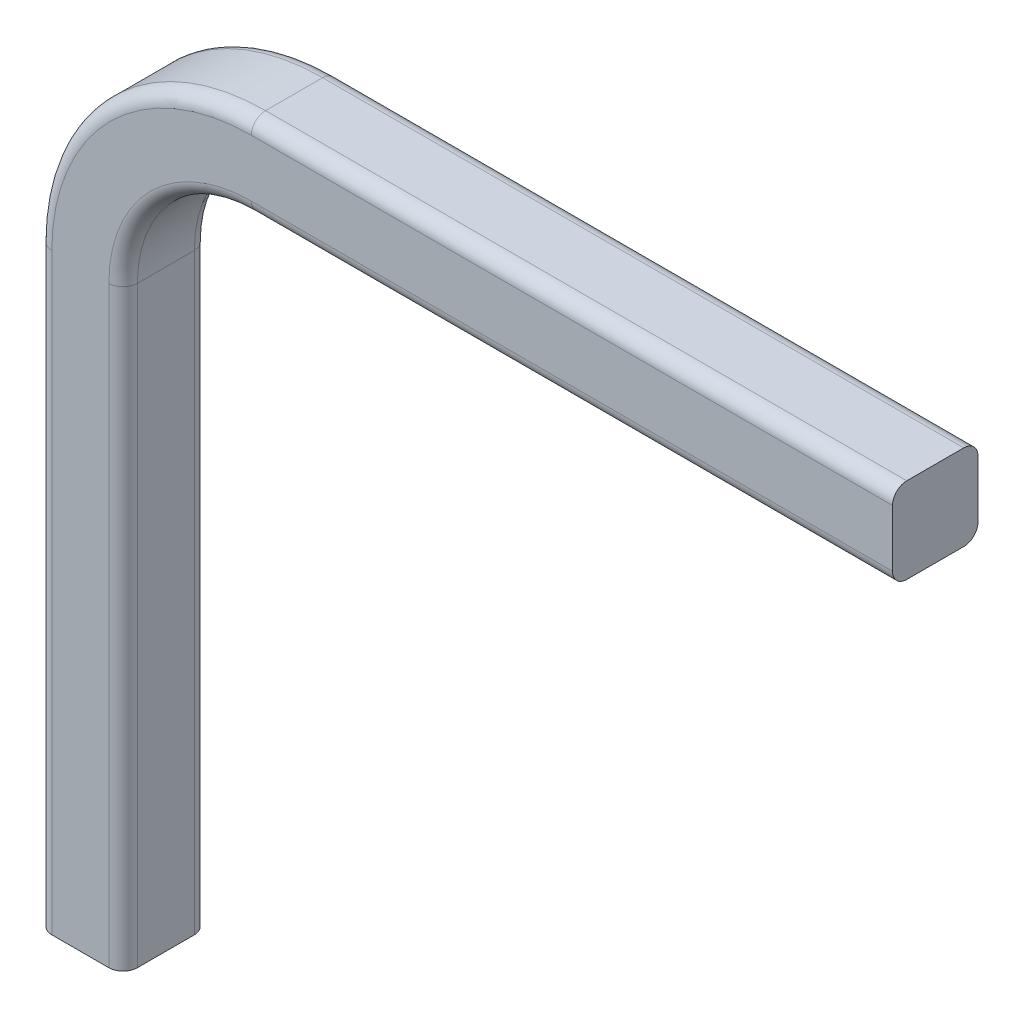
ISO-10303-21;
HEADER;
FILE_DESCRIPTION(('STEP AP214'),'2;1');
FILE_NAME('part.step','',(''),(''),'','','');
FILE_SCHEMA(('AUTOMOTIVE_DESIGN { 1 0 10303 214 1 1 1 1 }'));
ENDSEC;
DATA;
#1=APPLICATION_CONTEXT('core data for automotive mechanical design processes');
#2=APPLICATION_PROTOCOL_DEFINITION('international standard','automotive_design',2000,#1);
#3=PRODUCT_CONTEXT('',#1,'mechanical');
#4=PRODUCT('Part','Part','',(#3));
#5=PRODUCT_RELATED_PRODUCT_CATEGORY('part','',(#4));
#6=PRODUCT_DEFINITION_FORMATION('','',#4);
#7=PRODUCT_DEFINITION_CONTEXT('part definition',#1,'design');
#8=PRODUCT_DEFINITION('design','',#6,#7);
#9=PRODUCT_DEFINITION_SHAPE('','',#8);
#10=(LENGTH_UNIT() NAMED_UNIT(*) SI_UNIT(.MILLI.,.METRE.));
#11=(NAMED_UNIT(*) PLANE_ANGLE_UNIT() SI_UNIT($,.RADIAN.));
#12=(NAMED_UNIT(*) SI_UNIT($,.STERADIAN.) SOLID_ANGLE_UNIT());
#13=UNCERTAINTY_MEASURE_WITH_UNIT(LENGTH_MEASURE(1.E-05),#10,'distance_accuracy_value','');
#14=(GEOMETRIC_REPRESENTATION_CONTEXT(3) GLOBAL_UNCERTAINTY_ASSIGNED_CONTEXT((#13)) GLOBAL_UNIT_ASSIGNED_CONTEXT((#10,
#11,#12)) REPRESENTATION_CONTEXT('',''));
#15=CARTESIAN_POINT('',(0.,0.,0.));
#16=DIRECTION('',(0.,0.,1.));
#17=DIRECTION('',(1.,0.,0.));
#18=AXIS2_PLACEMENT_3D('',#15,#16,#17);
#19=CARTESIAN_POINT('',(0.381,-2.3876,0.));
#20=DIRECTION('',(0.,0.,1.));
#21=DIRECTION('',(1.,0.,0.));
#22=AXIS2_PLACEMENT_3D('',#19,#20,#21);
#23=PLANE('',#22);
#24=DIRECTION('',(0.,1.,0.));
#25=VECTOR('',#24,1.);
#26=CARTESIAN_POINT('',(0.635,-3.5814,0.));
#27=LINE('',#26,#25);
#28=CARTESIAN_POINT('',(0.635,-4.7752,0.));
#29=VERTEX_POINT('',#28);
#30=CARTESIAN_POINT('',(0.635,0.508,0.));
#31=VERTEX_POINT('',#30);
#32=EDGE_CURVE('E20',#29,#31,#27,.T.);
#33=ORIENTED_EDGE('',*,*,#32,.F.);
#34=DIRECTION('',(1.,0.,0.));
#35=VECTOR('',#34,1.);
#36=CARTESIAN_POINT('',(0.,-4.7752,0.));
#37=LINE('',#36,#35);
#38=CARTESIAN_POINT('',(0.127,-4.7752,0.));
#39=VERTEX_POINT('',#38);
#40=EDGE_CURVE('E175',#39,#29,#37,.T.);
#41=ORIENTED_EDGE('',*,*,#40,.F.);
#42=DIRECTION('',(0.,-1.,0.));
#43=VECTOR('',#42,1.);
#44=CARTESIAN_POINT('',(0.127,-1.1938,0.));
#45=LINE('',#44,#43);
#46=CARTESIAN_POINT('',(0.127,0.508,0.));
#47=VERTEX_POINT('',#46);
#48=EDGE_CURVE('E239',#47,#39,#45,.T.);
#49=ORIENTED_EDGE('',*,*,#48,.F.);
#50=CARTESIAN_POINT('',(1.905,0.508,0.));
#51=DIRECTION('',(0.,0.,1.));
#52=DIRECTION('',(-0.707106781186548,0.707106781186547,0.));
#53=AXIS2_PLACEMENT_3D('',#50,#51,#52);
#54=CIRCLE('',#53,1.778);
#55=CARTESIAN_POINT('',(1.905,2.286,0.));
#56=VERTEX_POINT('',#55);
#57=EDGE_CURVE('E212',#56,#47,#54,.T.);
#58=ORIENTED_EDGE('',*,*,#57,.F.);
#59=DIRECTION('',(-1.,0.,0.));
#60=VECTOR('',#59,1.);
#61=CARTESIAN_POINT('',(4.0005,2.286,0.));
#62=LINE('',#61,#60);
#63=CARTESIAN_POINT('',(7.62,2.286,0.));
#64=VERTEX_POINT('',#63);
#65=EDGE_CURVE('E190',#64,#56,#62,.T.);
#66=ORIENTED_EDGE('',*,*,#65,.F.);
#67=DIRECTION('',(0.,1.,0.));
#68=VECTOR('',#67,1.);
#69=CARTESIAN_POINT('',(7.62,1.651,0.));
#70=LINE('',#69,#68);
#71=CARTESIAN_POINT('',(7.62,1.778,0.));
#72=VERTEX_POINT('',#71);
#73=EDGE_CURVE('E224',#72,#64,#70,.T.);
#74=ORIENTED_EDGE('',*,*,#73,.F.);
#75=DIRECTION('',(1.,0.,0.));
#76=VECTOR('',#75,1.);
#77=CARTESIAN_POINT('',(1.143,1.778,0.));
#78=LINE('',#77,#76);
#79=CARTESIAN_POINT('',(1.905,1.778,0.));
#80=VERTEX_POINT('',#79);
#81=EDGE_CURVE('E264',#80,#72,#78,.T.);
#82=ORIENTED_EDGE('',*,*,#81,.F.);
#83=CARTESIAN_POINT('',(1.905,0.508,0.));
#84=DIRECTION('',(0.,0.,-1.));
#85=DIRECTION('',(-0.707106781186548,0.707106781186547,0.));
#86=AXIS2_PLACEMENT_3D('',#83,#84,#85);
#87=CIRCLE('',#86,1.27);
#88=EDGE_CURVE('E218',#31,#80,#87,.T.);
#89=ORIENTED_EDGE('',*,*,#88,.F.);
#90=EDGE_LOOP('',(#33,#41,#49,#58,#66,#74,#82,#89));
#91=FACE_BOUND('',#90,.T.);
#92=ADVANCED_FACE('F17',(#91),#23,.F.);
#93=CARTESIAN_POINT('',(0.381,-2.3876,0.762));
#94=DIRECTION('',(0.,0.,1.));
#95=DIRECTION('',(1.,0.,0.));
#96=AXIS2_PLACEMENT_3D('',#93,#94,#95);
#97=PLANE('',#96);
#98=DIRECTION('',(0.,1.,0.));
#99=VECTOR('',#98,1.);
#100=CARTESIAN_POINT('',(0.127,-1.1938,0.762));
#101=LINE('',#100,#99);
#102=CARTESIAN_POINT('',(0.127,-4.7752,0.762));
#103=VERTEX_POINT('',#102);
#104=CARTESIAN_POINT('',(0.127,0.508,0.762));
#105=VERTEX_POINT('',#104);
#106=EDGE_CURVE('E153',#103,#105,#101,.T.);
#107=ORIENTED_EDGE('',*,*,#106,.F.);
#108=DIRECTION('',(1.,0.,0.));
#109=VECTOR('',#108,1.);
#110=CARTESIAN_POINT('',(0.,-4.7752,0.762));
#111=LINE('',#110,#109);
#112=CARTESIAN_POINT('',(0.635,-4.7752,0.762));
#113=VERTEX_POINT('',#112);
#114=EDGE_CURVE('E158',#103,#113,#111,.T.);
#115=ORIENTED_EDGE('',*,*,#114,.T.);
#116=DIRECTION('',(0.,-1.,0.));
#117=VECTOR('',#116,1.);
#118=CARTESIAN_POINT('',(0.635,-3.5814,0.762));
#119=LINE('',#118,#117);
#120=CARTESIAN_POINT('',(0.635,0.508,0.762));
#121=VERTEX_POINT('',#120);
#122=EDGE_CURVE('E203',#121,#113,#119,.T.);
#123=ORIENTED_EDGE('',*,*,#122,.F.);
#124=CARTESIAN_POINT('',(1.905,0.508,0.762));
#125=DIRECTION('',(0.,0.,1.));
#126=DIRECTION('',(-0.707106781186548,0.707106781186547,0.));
#127=AXIS2_PLACEMENT_3D('',#124,#125,#126);
#128=CIRCLE('',#127,1.27);
#129=CARTESIAN_POINT('',(1.905,1.778,0.762));
#130=VERTEX_POINT('',#129);
#131=EDGE_CURVE('E27',#130,#121,#128,.T.);
#132=ORIENTED_EDGE('',*,*,#131,.F.);
#133=DIRECTION('',(-1.,0.,0.));
#134=VECTOR('',#133,1.);
#135=CARTESIAN_POINT('',(1.143,1.778,0.762));
#136=LINE('',#135,#134);
#137=CARTESIAN_POINT('',(7.62,1.778,0.762));
#138=VERTEX_POINT('',#137);
#139=EDGE_CURVE('E11',#138,#130,#136,.T.);
#140=ORIENTED_EDGE('',*,*,#139,.F.);
#141=DIRECTION('',(0.,1.,0.));
#142=VECTOR('',#141,1.);
#143=CARTESIAN_POINT('',(7.62,1.651,0.762));
#144=LINE('',#143,#142);
#145=CARTESIAN_POINT('',(7.62,2.286,0.762));
#146=VERTEX_POINT('',#145);
#147=EDGE_CURVE('E260',#138,#146,#144,.T.);
#148=ORIENTED_EDGE('',*,*,#147,.T.);
#149=DIRECTION('',(1.,0.,0.));
#150=VECTOR('',#149,1.);
#151=CARTESIAN_POINT('',(4.0005,2.286,0.762));
#152=LINE('',#151,#150);
#153=CARTESIAN_POINT('',(1.905,2.286,0.762));
#154=VERTEX_POINT('',#153);
#155=EDGE_CURVE('E250',#154,#146,#152,.T.);
#156=ORIENTED_EDGE('',*,*,#155,.F.);
#157=CARTESIAN_POINT('',(1.905,0.508,0.762));
#158=DIRECTION('',(0.,0.,-1.));
#159=DIRECTION('',(-0.707106781186548,0.707106781186547,0.));
#160=AXIS2_PLACEMENT_3D('',#157,#158,#159);
#161=CIRCLE('',#160,1.778);
#162=EDGE_CURVE('E161',#105,#154,#161,.T.);
#163=ORIENTED_EDGE('',*,*,#162,.F.);
#164=EDGE_LOOP('',(#107,#115,#123,#132,#140,#148,#156,#163));
#165=FACE_BOUND('',#164,.T.);
#166=ADVANCED_FACE('F155',(#165),#97,.T.);
#167=CARTESIAN_POINT('',(1.143,1.778,0.635));
#168=DIRECTION('',(1.,0.,0.));
#169=DIRECTION('',(0.,-0.707106781186548,0.707106781186548));
#170=AXIS2_PLACEMENT_3D('',#167,#168,#169);
#171=CYLINDRICAL_SURFACE('',#170,0.127);
#172=CARTESIAN_POINT('',(7.62,1.778,0.635));
#173=DIRECTION('',(-1.,0.,0.));
#174=DIRECTION('',(0.,-0.707106781186548,0.707106781186548));
#175=AXIS2_PLACEMENT_3D('',#172,#173,#174);
#176=CIRCLE('',#175,0.127);
#177=CARTESIAN_POINT('',(7.62,1.651,0.635));
#178=VERTEX_POINT('',#177);
#179=EDGE_CURVE('E257',#178,#138,#176,.T.);
#180=ORIENTED_EDGE('',*,*,#179,.T.);
#181=ORIENTED_EDGE('',*,*,#139,.T.);
#182=CARTESIAN_POINT('',(1.905,1.778,0.635));
#183=DIRECTION('',(-1.,0.,0.));
#184=DIRECTION('',(0.,-1.,0.));
#185=AXIS2_PLACEMENT_3D('',#182,#183,#184);
#186=CIRCLE('',#185,0.127);
#187=CARTESIAN_POINT('',(1.905,1.651,0.635));
#188=VERTEX_POINT('',#187);
#189=EDGE_CURVE('E206',#188,#130,#186,.T.);
#190=ORIENTED_EDGE('',*,*,#189,.F.);
#191=DIRECTION('',(1.,0.,0.));
#192=VECTOR('',#191,1.);
#193=CARTESIAN_POINT('',(1.143,1.651,0.635));
#194=LINE('',#193,#192);
#195=EDGE_CURVE('E195',#188,#178,#194,.T.);
#196=ORIENTED_EDGE('',*,*,#195,.T.);
#197=EDGE_LOOP('',(#180,#181,#190,#196));
#198=FACE_BOUND('',#197,.T.);
#199=ADVANCED_FACE('F423',(#198),#171,.T.);
#200=CARTESIAN_POINT('',(1.905,0.508,0.635));
#201=DIRECTION('',(0.,0.,-1.));
#202=DIRECTION('',(-1.,0.,0.));
#203=AXIS2_PLACEMENT_3D('',#200,#201,#202);
#204=TOROIDAL_SURFACE('',#203,1.27,0.127);
#205=ORIENTED_EDGE('',*,*,#189,.T.);
#206=ORIENTED_EDGE('',*,*,#131,.T.);
#207=CARTESIAN_POINT('',(0.635,0.508,0.635));
#208=DIRECTION('',(0.,-1.,0.));
#209=DIRECTION('',(1.,0.,0.));
#210=AXIS2_PLACEMENT_3D('',#207,#208,#209);
#211=CIRCLE('',#210,0.126999999999999);
#212=CARTESIAN_POINT('',(0.762,0.508,0.635));
#213=VERTEX_POINT('',#212);
#214=EDGE_CURVE('E165',#213,#121,#211,.T.);
#215=ORIENTED_EDGE('',*,*,#214,.F.);
#216=CARTESIAN_POINT('',(1.905,0.508,0.635));
#217=DIRECTION('',(0.,0.,-1.));
#218=DIRECTION('',(-0.707106781186548,0.707106781186548,0.));
#219=AXIS2_PLACEMENT_3D('',#216,#217,#218);
#220=CIRCLE('',#219,1.143);
#221=EDGE_CURVE('E196',#213,#188,#220,.T.);
#222=ORIENTED_EDGE('',*,*,#221,.T.);
#223=EDGE_LOOP('',(#205,#206,#215,#222));
#224=FACE_BOUND('',#223,.T.);
#225=ADVANCED_FACE('F428',(#224),#204,.T.);
#226=CARTESIAN_POINT('',(0.635,-3.5814,0.635));
#227=DIRECTION('',(0.,1.,0.));
#228=DIRECTION('',(0.707106781186548,0.,0.707106781186548));
#229=AXIS2_PLACEMENT_3D('',#226,#227,#228);
#230=CYLINDRICAL_SURFACE('',#229,0.127);
#231=CARTESIAN_POINT('',(0.635,-4.7752,0.635));
#232=DIRECTION('',(0.,1.,0.));
#233=DIRECTION('',(0.707106781186548,0.,0.707106781186548));
#234=AXIS2_PLACEMENT_3D('',#231,#232,#233);
#235=CIRCLE('',#234,0.127);
#236=CARTESIAN_POINT('',(0.762,-4.7752,0.635));
#237=VERTEX_POINT('',#236);
#238=EDGE_CURVE('E180',#113,#237,#235,.T.);
#239=ORIENTED_EDGE('',*,*,#238,.T.);
#240=DIRECTION('',(0.,1.,0.));
#241=VECTOR('',#240,1.);
#242=CARTESIAN_POINT('',(0.762,-3.5814,0.635));
#243=LINE('',#242,#241);
#244=EDGE_CURVE('E251',#237,#213,#243,.T.);
#245=ORIENTED_EDGE('',*,*,#244,.T.);
#246=ORIENTED_EDGE('',*,*,#214,.T.);
#247=ORIENTED_EDGE('',*,*,#122,.T.);
#248=EDGE_LOOP('',(#239,#245,#246,#247));
#249=FACE_BOUND('',#248,.T.);
#250=ADVANCED_FACE('F439',(#249),#230,.T.);
#251=CARTESIAN_POINT('',(0.127,-1.1938,0.635));
#252=DIRECTION('',(0.,-1.,0.));
#253=DIRECTION('',(-0.707106781186548,0.,0.707106781186547));
#254=AXIS2_PLACEMENT_3D('',#251,#252,#253);
#255=CYLINDRICAL_SURFACE('',#254,0.127);
#256=CARTESIAN_POINT('',(0.127,-4.7752,0.635));
#257=DIRECTION('',(0.,1.,0.));
#258=DIRECTION('',(-0.707106781186548,0.,0.707106781186547));
#259=AXIS2_PLACEMENT_3D('',#256,#257,#258);
#260=CIRCLE('',#259,0.127);
#261=CARTESIAN_POINT('',(0.,-4.7752,0.635));
#262=VERTEX_POINT('',#261);
#263=EDGE_CURVE('E168',#262,#103,#260,.T.);
#264=ORIENTED_EDGE('',*,*,#263,.T.);
#265=ORIENTED_EDGE('',*,*,#106,.T.);
#266=CARTESIAN_POINT('',(0.127,0.508,0.635));
#267=DIRECTION('',(0.,1.,0.));
#268=DIRECTION('',(-1.,0.,0.));
#269=AXIS2_PLACEMENT_3D('',#266,#267,#268);
#270=CIRCLE('',#269,0.127);
#271=CARTESIAN_POINT('',(0.,0.508,0.635));
#272=VERTEX_POINT('',#271);
#273=EDGE_CURVE('E247',#272,#105,#270,.T.);
#274=ORIENTED_EDGE('',*,*,#273,.F.);
#275=DIRECTION('',(0.,-1.,0.));
#276=VECTOR('',#275,1.);
#277=CARTESIAN_POINT('',(0.,-1.1938,0.635));
#278=LINE('',#277,#276);
#279=EDGE_CURVE('E171',#272,#262,#278,.T.);
#280=ORIENTED_EDGE('',*,*,#279,.T.);
#281=EDGE_LOOP('',(#264,#265,#274,#280));
#282=FACE_BOUND('',#281,.T.);
#283=ADVANCED_FACE('F169',(#282),#255,.T.);
#284=CARTESIAN_POINT('',(1.905,0.508,0.635));
#285=DIRECTION('',(0.,0.,1.));
#286=DIRECTION('',(1.,0.,0.));
#287=AXIS2_PLACEMENT_3D('',#284,#285,#286);
#288=TOROIDAL_SURFACE('',#287,1.778,0.127);
#289=ORIENTED_EDGE('',*,*,#273,.T.);
#290=ORIENTED_EDGE('',*,*,#162,.T.);
#291=CARTESIAN_POINT('',(1.905,2.286,0.635));
#292=DIRECTION('',(1.,0.,0.));
#293=DIRECTION('',(0.,1.,0.));
#294=AXIS2_PLACEMENT_3D('',#291,#292,#293);
#295=CIRCLE('',#294,0.127);
#296=CARTESIAN_POINT('',(1.905,2.413,0.635));
#297=VERTEX_POINT('',#296);
#298=EDGE_CURVE('E293',#297,#154,#295,.T.);
#299=ORIENTED_EDGE('',*,*,#298,.F.);
#300=CARTESIAN_POINT('',(1.905,0.508,0.635));
#301=DIRECTION('',(0.,0.,1.));
#302=DIRECTION('',(-0.707106781186548,0.707106781186547,0.));
#303=AXIS2_PLACEMENT_3D('',#300,#301,#302);
#304=CIRCLE('',#303,1.905);
#305=EDGE_CURVE('E267',#297,#272,#304,.T.);
#306=ORIENTED_EDGE('',*,*,#305,.T.);
#307=EDGE_LOOP('',(#289,#290,#299,#306));
#308=FACE_BOUND('',#307,.T.);
#309=ADVANCED_FACE('F435',(#308),#288,.T.);
#310=CARTESIAN_POINT('',(4.0005,2.286,0.635));
#311=DIRECTION('',(-1.,0.,0.));
#312=DIRECTION('',(0.,0.707106781186546,0.707106781186549));
#313=AXIS2_PLACEMENT_3D('',#310,#311,#312);
#314=CYLINDRICAL_SURFACE('',#313,0.127);
#315=CARTESIAN_POINT('',(7.62,2.286,0.635));
#316=DIRECTION('',(-1.,0.,0.));
#317=DIRECTION('',(0.,0.707106781186546,0.707106781186549));
#318=AXIS2_PLACEMENT_3D('',#315,#316,#317);
#319=CIRCLE('',#318,0.127);
#320=CARTESIAN_POINT('',(7.62,2.413,0.635));
#321=VERTEX_POINT('',#320);
#322=EDGE_CURVE('E232',#146,#321,#319,.T.);
#323=ORIENTED_EDGE('',*,*,#322,.T.);
#324=DIRECTION('',(-1.,0.,0.));
#325=VECTOR('',#324,1.);
#326=CARTESIAN_POINT('',(4.0005,2.413,0.635));
#327=LINE('',#326,#325);
#328=EDGE_CURVE('E197',#321,#297,#327,.T.);
#329=ORIENTED_EDGE('',*,*,#328,.T.);
#330=ORIENTED_EDGE('',*,*,#298,.T.);
#331=ORIENTED_EDGE('',*,*,#155,.T.);
#332=EDGE_LOOP('',(#323,#329,#330,#331));
#333=FACE_BOUND('',#332,.T.);
#334=ADVANCED_FACE('F432',(#333),#314,.T.);
#335=CARTESIAN_POINT('',(0.,-4.7752,0.));
#336=DIRECTION('',(0.,-1.,0.));
#337=DIRECTION('',(0.,0.,-1.));
#338=AXIS2_PLACEMENT_3D('',#335,#336,#337);
#339=PLANE('',#338);
#340=CARTESIAN_POINT('',(0.635,-4.7752,0.127));
#341=DIRECTION('',(0.,1.,0.));
#342=DIRECTION('',(0.707106781186547,0.,-0.707106781186548));
#343=AXIS2_PLACEMENT_3D('',#340,#341,#342);
#344=CIRCLE('',#343,0.127);
#345=CARTESIAN_POINT('',(0.762,-4.7752,0.127));
#346=VERTEX_POINT('',#345);
#347=EDGE_CURVE('E340',#346,#29,#344,.T.);
#348=ORIENTED_EDGE('',*,*,#347,.F.);
#349=DIRECTION('',(0.,0.,1.));
#350=VECTOR('',#349,1.);
#351=CARTESIAN_POINT('',(0.762,-4.7752,0.));
#352=LINE('',#351,#350);
#353=EDGE_CURVE('E255',#346,#237,#352,.T.);
#354=ORIENTED_EDGE('',*,*,#353,.T.);
#355=ORIENTED_EDGE('',*,*,#238,.F.);
#356=ORIENTED_EDGE('',*,*,#114,.F.);
#357=ORIENTED_EDGE('',*,*,#263,.F.);
#358=DIRECTION('',(0.,0.,1.));
#359=VECTOR('',#358,1.);
#360=CARTESIAN_POINT('',(0.,-4.7752,0.));
#361=LINE('',#360,#359);
#362=CARTESIAN_POINT('',(0.,-4.7752,0.127));
#363=VERTEX_POINT('',#362);
#364=EDGE_CURVE('E270',#363,#262,#361,.T.);
#365=ORIENTED_EDGE('',*,*,#364,.F.);
#366=CARTESIAN_POINT('',(0.127,-4.7752,0.127));
#367=DIRECTION('',(0.,1.,0.));
#368=DIRECTION('',(-0.707106781186548,0.,-0.707106781186547));
#369=AXIS2_PLACEMENT_3D('',#366,#367,#368);
#370=CIRCLE('',#369,0.127);
#371=EDGE_CURVE('E207',#39,#363,#370,.T.);
#372=ORIENTED_EDGE('',*,*,#371,.F.);
#373=ORIENTED_EDGE('',*,*,#40,.T.);
#374=EDGE_LOOP('',(#348,#354,#355,#356,#357,#365,#372,#373));
#375=FACE_BOUND('',#374,.T.);
#376=ADVANCED_FACE('F178',(#375),#339,.T.);
#377=CARTESIAN_POINT('',(0.,0.,0.));
#378=DIRECTION('',(-1.,0.,0.));
#379=DIRECTION('',(0.,1.,0.));
#380=AXIS2_PLACEMENT_3D('',#377,#378,#379);
#381=PLANE('',#380);
#382=DIRECTION('',(0.,1.,0.));
#383=VECTOR('',#382,1.);
#384=CARTESIAN_POINT('',(0.,-1.1938,0.127));
#385=LINE('',#384,#383);
#386=CARTESIAN_POINT('',(0.,0.508,0.127));
#387=VERTEX_POINT('',#386);
#388=EDGE_CURVE('E211',#363,#387,#385,.T.);
#389=ORIENTED_EDGE('',*,*,#388,.F.);
#390=ORIENTED_EDGE('',*,*,#364,.T.);
#391=ORIENTED_EDGE('',*,*,#279,.F.);
#392=DIRECTION('',(0.,0.,1.));
#393=VECTOR('',#392,1.);
#394=CARTESIAN_POINT('',(0.,0.508,0.));
#395=LINE('',#394,#393);
#396=EDGE_CURVE('E201',#387,#272,#395,.T.);
#397=ORIENTED_EDGE('',*,*,#396,.F.);
#398=EDGE_LOOP('',(#389,#390,#391,#397));
#399=FACE_BOUND('',#398,.T.);
#400=ADVANCED_FACE('F447',(#399),#381,.T.);
#401=CARTESIAN_POINT('',(1.905,0.508,0.));
#402=DIRECTION('',(0.,0.,1.));
#403=DIRECTION('',(0.,1.,0.));
#404=AXIS2_PLACEMENT_3D('',#401,#402,#403);
#405=CYLINDRICAL_SURFACE('',#404,1.905);
#406=CARTESIAN_POINT('',(1.905,0.508,0.127));
#407=DIRECTION('',(0.,0.,-1.));
#408=DIRECTION('',(-0.707106781186548,0.707106781186547,0.));
#409=AXIS2_PLACEMENT_3D('',#406,#407,#408);
#410=CIRCLE('',#409,1.905);
#411=CARTESIAN_POINT('',(1.905,2.413,0.127));
#412=VERTEX_POINT('',#411);
#413=EDGE_CURVE('E228',#387,#412,#410,.T.);
#414=ORIENTED_EDGE('',*,*,#413,.F.);
#415=ORIENTED_EDGE('',*,*,#396,.T.);
#416=ORIENTED_EDGE('',*,*,#305,.F.);
#417=DIRECTION('',(0.,0.,1.));
#418=VECTOR('',#417,1.);
#419=CARTESIAN_POINT('',(1.905,2.413,0.));
#420=LINE('',#419,#418);
#421=EDGE_CURVE('E202',#412,#297,#420,.T.);
#422=ORIENTED_EDGE('',*,*,#421,.F.);
#423=EDGE_LOOP('',(#414,#415,#416,#422));
#424=FACE_BOUND('',#423,.T.);
#425=ADVANCED_FACE('F380',(#424),#405,.T.);
#426=CARTESIAN_POINT('',(7.62,2.413,0.));
#427=DIRECTION('',(0.,1.,0.));
#428=DIRECTION('',(1.,0.,0.));
#429=AXIS2_PLACEMENT_3D('',#426,#427,#428);
#430=PLANE('',#429);
#431=DIRECTION('',(1.,0.,0.));
#432=VECTOR('',#431,1.);
#433=CARTESIAN_POINT('',(4.0005,2.413,0.127));
#434=LINE('',#433,#432);
#435=CARTESIAN_POINT('',(7.62,2.413,0.127));
#436=VERTEX_POINT('',#435);
#437=EDGE_CURVE('E304',#412,#436,#434,.T.);
#438=ORIENTED_EDGE('',*,*,#437,.F.);
#439=ORIENTED_EDGE('',*,*,#421,.T.);
#440=ORIENTED_EDGE('',*,*,#328,.F.);
#441=DIRECTION('',(0.,0.,1.));
#442=VECTOR('',#441,1.);
#443=CARTESIAN_POINT('',(7.62,2.413,0.));
#444=LINE('',#443,#442);
#445=EDGE_CURVE('E223',#436,#321,#444,.T.);
#446=ORIENTED_EDGE('',*,*,#445,.F.);
#447=EDGE_LOOP('',(#438,#439,#440,#446));
#448=FACE_BOUND('',#447,.T.);
#449=ADVANCED_FACE('F383',(#448),#430,.T.);
#450=CARTESIAN_POINT('',(0.127,-1.1938,0.127));
#451=DIRECTION('',(0.,-1.,0.));
#452=DIRECTION('',(-0.707106781186548,0.,-0.707106781186547));
#453=AXIS2_PLACEMENT_3D('',#450,#451,#452);
#454=CYLINDRICAL_SURFACE('',#453,0.127);
#455=ORIENTED_EDGE('',*,*,#371,.T.);
#456=ORIENTED_EDGE('',*,*,#388,.T.);
#457=CARTESIAN_POINT('',(0.127,0.508,0.127));
#458=DIRECTION('',(0.,1.,0.));
#459=DIRECTION('',(0.,0.,-1.));
#460=AXIS2_PLACEMENT_3D('',#457,#458,#459);
#461=CIRCLE('',#460,0.127);
#462=EDGE_CURVE('E236',#47,#387,#461,.T.);
#463=ORIENTED_EDGE('',*,*,#462,.F.);
#464=ORIENTED_EDGE('',*,*,#48,.T.);
#465=EDGE_LOOP('',(#455,#456,#463,#464));
#466=FACE_BOUND('',#465,.T.);
#467=ADVANCED_FACE('F376',(#466),#454,.T.);
#468=CARTESIAN_POINT('',(1.905,0.508,0.127));
#469=DIRECTION('',(0.,0.,1.));
#470=DIRECTION('',(1.,0.,0.));
#471=AXIS2_PLACEMENT_3D('',#468,#469,#470);
#472=TOROIDAL_SURFACE('',#471,1.778,0.127);
#473=ORIENTED_EDGE('',*,*,#462,.T.);
#474=ORIENTED_EDGE('',*,*,#413,.T.);
#475=CARTESIAN_POINT('',(1.905,2.286,0.127));
#476=DIRECTION('',(1.,0.,0.));
#477=DIRECTION('',(0.,0.,-1.));
#478=AXIS2_PLACEMENT_3D('',#475,#476,#477);
#479=CIRCLE('',#478,0.127);
#480=EDGE_CURVE('E300',#56,#412,#479,.T.);
#481=ORIENTED_EDGE('',*,*,#480,.F.);
#482=ORIENTED_EDGE('',*,*,#57,.T.);
#483=EDGE_LOOP('',(#473,#474,#481,#482));
#484=FACE_BOUND('',#483,.T.);
#485=ADVANCED_FACE('F371',(#484),#472,.T.);
#486=CARTESIAN_POINT('',(4.0005,2.286,0.127));
#487=DIRECTION('',(-1.,0.,0.));
#488=DIRECTION('',(0.,0.707106781186546,-0.707106781186549));
#489=AXIS2_PLACEMENT_3D('',#486,#487,#488);
#490=CYLINDRICAL_SURFACE('',#489,0.127);
#491=CARTESIAN_POINT('',(7.62,2.286,0.127));
#492=DIRECTION('',(-1.,0.,0.));
#493=DIRECTION('',(0.,0.707106781186546,-0.707106781186549));
#494=AXIS2_PLACEMENT_3D('',#491,#492,#493);
#495=CIRCLE('',#494,0.127);
#496=EDGE_CURVE('E219',#436,#64,#495,.T.);
#497=ORIENTED_EDGE('',*,*,#496,.T.);
#498=ORIENTED_EDGE('',*,*,#65,.T.);
#499=ORIENTED_EDGE('',*,*,#480,.T.);
#500=ORIENTED_EDGE('',*,*,#437,.T.);
#501=EDGE_LOOP('',(#497,#498,#499,#500));
#502=FACE_BOUND('',#501,.T.);
#503=ADVANCED_FACE('F388',(#502),#490,.T.);
#504=CARTESIAN_POINT('',(7.62,1.651,0.));
#505=DIRECTION('',(1.,0.,0.));
#506=DIRECTION('',(0.,1.,0.));
#507=AXIS2_PLACEMENT_3D('',#504,#505,#506);
#508=PLANE('',#507);
#509=CARTESIAN_POINT('',(7.62,1.778,0.127));
#510=DIRECTION('',(-1.,0.,0.));
#511=DIRECTION('',(0.,-0.707106781186547,-0.707106781186548));
#512=AXIS2_PLACEMENT_3D('',#509,#510,#511);
#513=CIRCLE('',#512,0.127);
#514=CARTESIAN_POINT('',(7.62,1.651,0.127));
#515=VERTEX_POINT('',#514);
#516=EDGE_CURVE('E213',#72,#515,#513,.T.);
#517=ORIENTED_EDGE('',*,*,#516,.F.);
#518=ORIENTED_EDGE('',*,*,#73,.T.);
#519=ORIENTED_EDGE('',*,*,#496,.F.);
#520=ORIENTED_EDGE('',*,*,#445,.T.);
#521=ORIENTED_EDGE('',*,*,#322,.F.);
#522=ORIENTED_EDGE('',*,*,#147,.F.);
#523=ORIENTED_EDGE('',*,*,#179,.F.);
#524=DIRECTION('',(0.,0.,1.));
#525=VECTOR('',#524,1.);
#526=CARTESIAN_POINT('',(7.62,1.651,0.));
#527=LINE('',#526,#525);
#528=EDGE_CURVE('E192',#515,#178,#527,.T.);
#529=ORIENTED_EDGE('',*,*,#528,.F.);
#530=EDGE_LOOP('',(#517,#518,#519,#520,#521,#522,#523,#529));
#531=FACE_BOUND('',#530,.T.);
#532=ADVANCED_FACE('F397',(#531),#508,.T.);
#533=CARTESIAN_POINT('',(1.905,1.651,0.));
#534=DIRECTION('',(0.,-1.,0.));
#535=DIRECTION('',(0.,0.,-1.));
#536=AXIS2_PLACEMENT_3D('',#533,#534,#535);
#537=PLANE('',#536);
#538=DIRECTION('',(-1.,0.,0.));
#539=VECTOR('',#538,1.);
#540=CARTESIAN_POINT('',(1.143,1.651,0.127));
#541=LINE('',#540,#539);
#542=CARTESIAN_POINT('',(1.905,1.651,0.127));
#543=VERTEX_POINT('',#542);
#544=EDGE_CURVE('E217',#515,#543,#541,.T.);
#545=ORIENTED_EDGE('',*,*,#544,.F.);
#546=ORIENTED_EDGE('',*,*,#528,.T.);
#547=ORIENTED_EDGE('',*,*,#195,.F.);
#548=DIRECTION('',(0.,0.,1.));
#549=VECTOR('',#548,1.);
#550=CARTESIAN_POINT('',(1.905,1.651,0.));
#551=LINE('',#550,#549);
#552=EDGE_CURVE('E289',#543,#188,#551,.T.);
#553=ORIENTED_EDGE('',*,*,#552,.F.);
#554=EDGE_LOOP('',(#545,#546,#547,#553));
#555=FACE_BOUND('',#554,.T.);
#556=ADVANCED_FACE('F402',(#555),#537,.T.);
#557=CARTESIAN_POINT('',(1.905,0.508,0.));
#558=DIRECTION('',(0.,0.,1.));
#559=DIRECTION('',(0.,-1.,0.));
#560=AXIS2_PLACEMENT_3D('',#557,#558,#559);
#561=CYLINDRICAL_SURFACE('',#560,1.143);
#562=CARTESIAN_POINT('',(1.905,0.508,0.127));
#563=DIRECTION('',(0.,0.,1.));
#564=DIRECTION('',(-0.707106781186548,0.707106781186548,0.));
#565=AXIS2_PLACEMENT_3D('',#562,#563,#564);
#566=CIRCLE('',#565,1.143);
#567=CARTESIAN_POINT('',(0.762,0.508,0.127));
#568=VERTEX_POINT('',#567);
#569=EDGE_CURVE('E283',#543,#568,#566,.T.);
#570=ORIENTED_EDGE('',*,*,#569,.F.);
#571=ORIENTED_EDGE('',*,*,#552,.T.);
#572=ORIENTED_EDGE('',*,*,#221,.F.);
#573=DIRECTION('',(0.,0.,1.));
#574=VECTOR('',#573,1.);
#575=CARTESIAN_POINT('',(0.762,0.508,0.));
#576=LINE('',#575,#574);
#577=EDGE_CURVE('E256',#568,#213,#576,.T.);
#578=ORIENTED_EDGE('',*,*,#577,.F.);
#579=EDGE_LOOP('',(#570,#571,#572,#578));
#580=FACE_BOUND('',#579,.T.);
#581=ADVANCED_FACE('F405',(#580),#561,.F.);
#582=CARTESIAN_POINT('',(0.762,-4.7752,0.));
#583=DIRECTION('',(1.,0.,0.));
#584=DIRECTION('',(0.,1.,0.));
#585=AXIS2_PLACEMENT_3D('',#582,#583,#584);
#586=PLANE('',#585);
#587=DIRECTION('',(0.,-1.,0.));
#588=VECTOR('',#587,1.);
#589=CARTESIAN_POINT('',(0.762,-3.5814,0.127));
#590=LINE('',#589,#588);
#591=EDGE_CURVE('E241',#568,#346,#590,.T.);
#592=ORIENTED_EDGE('',*,*,#591,.F.);
#593=ORIENTED_EDGE('',*,*,#577,.T.);
#594=ORIENTED_EDGE('',*,*,#244,.F.);
#595=ORIENTED_EDGE('',*,*,#353,.F.);
#596=EDGE_LOOP('',(#592,#593,#594,#595));
#597=FACE_BOUND('',#596,.T.);
#598=ADVANCED_FACE('F358',(#597),#586,.T.);
#599=CARTESIAN_POINT('',(1.143,1.778,0.127));
#600=DIRECTION('',(1.,0.,0.));
#601=DIRECTION('',(0.,-0.707106781186547,-0.707106781186548));
#602=AXIS2_PLACEMENT_3D('',#599,#600,#601);
#603=CYLINDRICAL_SURFACE('',#602,0.127);
#604=ORIENTED_EDGE('',*,*,#516,.T.);
#605=ORIENTED_EDGE('',*,*,#544,.T.);
#606=CARTESIAN_POINT('',(1.905,1.778,0.127));
#607=DIRECTION('',(-1.,0.,0.));
#608=DIRECTION('',(0.,0.,-1.));
#609=AXIS2_PLACEMENT_3D('',#606,#607,#608);
#610=CIRCLE('',#609,0.127);
#611=EDGE_CURVE('E245',#80,#543,#610,.T.);
#612=ORIENTED_EDGE('',*,*,#611,.F.);
#613=ORIENTED_EDGE('',*,*,#81,.T.);
#614=EDGE_LOOP('',(#604,#605,#612,#613));
#615=FACE_BOUND('',#614,.T.);
#616=ADVANCED_FACE('F396',(#615),#603,.T.);
#617=CARTESIAN_POINT('',(1.905,0.508,0.127));
#618=DIRECTION('',(0.,0.,-1.));
#619=DIRECTION('',(-1.,0.,0.));
#620=AXIS2_PLACEMENT_3D('',#617,#618,#619);
#621=TOROIDAL_SURFACE('',#620,1.27,0.127);
#622=ORIENTED_EDGE('',*,*,#611,.T.);
#623=ORIENTED_EDGE('',*,*,#569,.T.);
#624=CARTESIAN_POINT('',(0.635,0.508,0.127));
#625=DIRECTION('',(0.,-1.,0.));
#626=DIRECTION('',(0.,0.,-1.));
#627=AXIS2_PLACEMENT_3D('',#624,#625,#626);
#628=CIRCLE('',#627,0.127);
#629=EDGE_CURVE('E246',#31,#568,#628,.T.);
#630=ORIENTED_EDGE('',*,*,#629,.F.);
#631=ORIENTED_EDGE('',*,*,#88,.T.);
#632=EDGE_LOOP('',(#622,#623,#630,#631));
#633=FACE_BOUND('',#632,.T.);
#634=ADVANCED_FACE('F408',(#633),#621,.T.);
#635=CARTESIAN_POINT('',(0.635,-3.5814,0.127));
#636=DIRECTION('',(0.,1.,0.));
#637=DIRECTION('',(0.707106781186547,0.,-0.707106781186548));
#638=AXIS2_PLACEMENT_3D('',#635,#636,#637);
#639=CYLINDRICAL_SURFACE('',#638,0.127);
#640=ORIENTED_EDGE('',*,*,#347,.T.);
#641=ORIENTED_EDGE('',*,*,#32,.T.);
#642=ORIENTED_EDGE('',*,*,#629,.T.);
#643=ORIENTED_EDGE('',*,*,#591,.T.);
#644=EDGE_LOOP('',(#640,#641,#642,#643));
#645=FACE_BOUND('',#644,.T.);
#646=ADVANCED_FACE('F355',(#645),#639,.T.);
#647=CLOSED_SHELL('',(#92,#166,#199,#225,#250,#283,#309,#334,#376,#400,#425,#449,#467,#485,#503,
#532,#556,#581,#598,#616,#634,#646));
#648=MANIFOLD_SOLID_BREP('B1',#647);
#649=ADVANCED_BREP_SHAPE_REPRESENTATION('',(#18,#648),#14);
#650=SHAPE_DEFINITION_REPRESENTATION(#9,#649);
ENDSEC;
END-ISO-10303-21;
